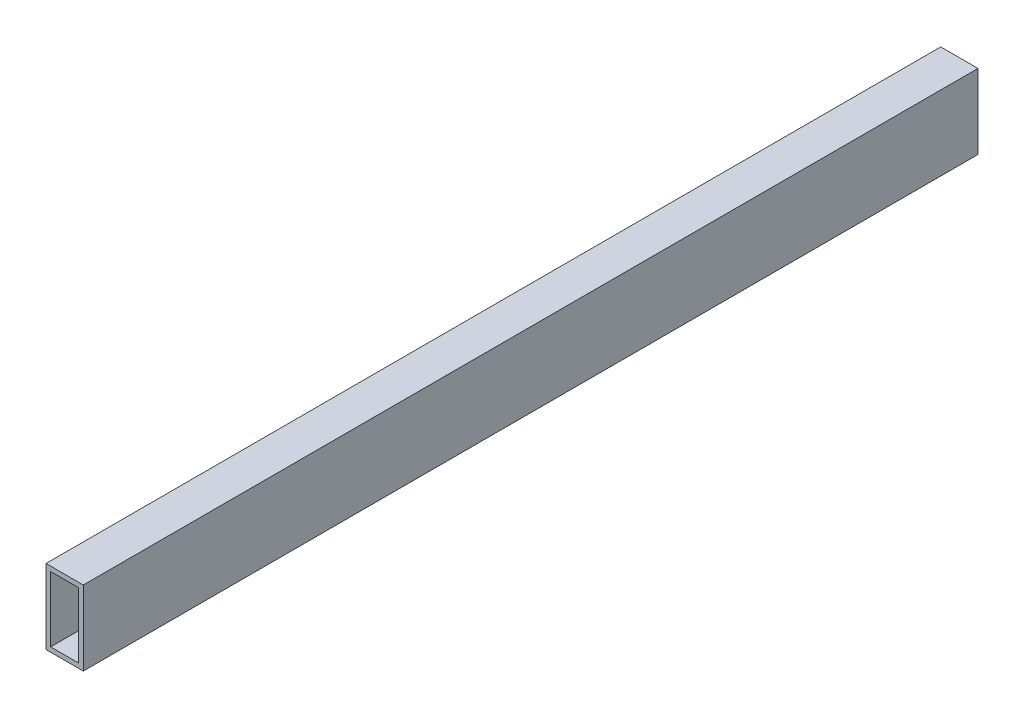
ISO-10303-21;
HEADER;
FILE_DESCRIPTION(('STEP AP214'),'2;1');
FILE_NAME('part.step','',(''),(''),'','','');
FILE_SCHEMA(('AUTOMOTIVE_DESIGN { 1 0 10303 214 1 1 1 1 }'));
ENDSEC;
DATA;
#1=APPLICATION_CONTEXT('core data for automotive mechanical design processes');
#2=APPLICATION_PROTOCOL_DEFINITION('international standard','automotive_design',2000,#1);
#3=PRODUCT_CONTEXT('',#1,'mechanical');
#4=PRODUCT('Part','Part','',(#3));
#5=PRODUCT_RELATED_PRODUCT_CATEGORY('part','',(#4));
#6=PRODUCT_DEFINITION_FORMATION('','',#4);
#7=PRODUCT_DEFINITION_CONTEXT('part definition',#1,'design');
#8=PRODUCT_DEFINITION('design','',#6,#7);
#9=PRODUCT_DEFINITION_SHAPE('','',#8);
#10=(LENGTH_UNIT() NAMED_UNIT(*) SI_UNIT(.MILLI.,.METRE.));
#11=(NAMED_UNIT(*) PLANE_ANGLE_UNIT() SI_UNIT($,.RADIAN.));
#12=(NAMED_UNIT(*) SI_UNIT($,.STERADIAN.) SOLID_ANGLE_UNIT());
#13=UNCERTAINTY_MEASURE_WITH_UNIT(LENGTH_MEASURE(1.E-05),#10,'distance_accuracy_value','');
#14=(GEOMETRIC_REPRESENTATION_CONTEXT(3) GLOBAL_UNCERTAINTY_ASSIGNED_CONTEXT((#13)) GLOBAL_UNIT_ASSIGNED_CONTEXT((#10,
#11,#12)) REPRESENTATION_CONTEXT('',''));
#15=CARTESIAN_POINT('',(0.,0.,0.));
#16=DIRECTION('',(0.,0.,1.));
#17=DIRECTION('',(1.,0.,0.));
#18=AXIS2_PLACEMENT_3D('',#15,#16,#17);
#19=CARTESIAN_POINT('',(0.,0.,609.6));
#20=DIRECTION('',(0.,0.,-1.));
#21=DIRECTION('',(-1.,0.,0.));
#22=AXIS2_PLACEMENT_3D('',#19,#20,#21);
#23=PLANE('',#22);
#24=DIRECTION('',(0.,-1.,0.));
#25=VECTOR('',#24,1.);
#26=CARTESIAN_POINT('',(0.,0.,609.6));
#27=LINE('',#26,#25);
#28=CARTESIAN_POINT('',(0.,50.8,609.6));
#29=VERTEX_POINT('',#28);
#30=CARTESIAN_POINT('',(0.,0.,609.6));
#31=VERTEX_POINT('',#30);
#32=EDGE_CURVE('E159',#29,#31,#27,.T.);
#33=ORIENTED_EDGE('',*,*,#32,.T.);
#34=DIRECTION('',(1.,0.,0.));
#35=VECTOR('',#34,1.);
#36=CARTESIAN_POINT('',(0.,0.,609.6));
#37=LINE('',#36,#35);
#38=CARTESIAN_POINT('',(25.4,0.,609.6));
#39=VERTEX_POINT('',#38);
#40=EDGE_CURVE('E163',#31,#39,#37,.T.);
#41=ORIENTED_EDGE('',*,*,#40,.T.);
#42=DIRECTION('',(0.,1.,0.));
#43=VECTOR('',#42,1.);
#44=CARTESIAN_POINT('',(25.4,0.,609.6));
#45=LINE('',#44,#43);
#46=CARTESIAN_POINT('',(25.4,50.8,609.6));
#47=VERTEX_POINT('',#46);
#48=EDGE_CURVE('E167',#39,#47,#45,.T.);
#49=ORIENTED_EDGE('',*,*,#48,.T.);
#50=DIRECTION('',(-1.,0.,0.));
#51=VECTOR('',#50,1.);
#52=CARTESIAN_POINT('',(0.,50.8,609.6));
#53=LINE('',#52,#51);
#54=EDGE_CURVE('E170',#47,#29,#53,.T.);
#55=ORIENTED_EDGE('',*,*,#54,.T.);
#56=EDGE_LOOP('',(#33,#41,#49,#55));
#57=FACE_BOUND('',#56,.T.);
#58=DIRECTION('',(0.,-1.,0.));
#59=VECTOR('',#58,1.);
#60=CARTESIAN_POINT('',(3.175,3.175,609.6));
#61=LINE('',#60,#59);
#62=CARTESIAN_POINT('',(3.175,47.625,609.6));
#63=VERTEX_POINT('',#62);
#64=CARTESIAN_POINT('',(3.175,3.175,609.6));
#65=VERTEX_POINT('',#64);
#66=EDGE_CURVE('E111',#63,#65,#61,.T.);
#67=ORIENTED_EDGE('',*,*,#66,.F.);
#68=DIRECTION('',(-1.,0.,0.));
#69=VECTOR('',#68,1.);
#70=CARTESIAN_POINT('',(3.175,47.625,609.6));
#71=LINE('',#70,#69);
#72=CARTESIAN_POINT('',(22.225,47.625,609.6));
#73=VERTEX_POINT('',#72);
#74=EDGE_CURVE('E137',#73,#63,#71,.T.);
#75=ORIENTED_EDGE('',*,*,#74,.F.);
#76=DIRECTION('',(0.,1.,0.));
#77=VECTOR('',#76,1.);
#78=CARTESIAN_POINT('',(22.225,3.175,609.6));
#79=LINE('',#78,#77);
#80=CARTESIAN_POINT('',(22.225,3.175,609.6));
#81=VERTEX_POINT('',#80);
#82=EDGE_CURVE('E133',#81,#73,#79,.T.);
#83=ORIENTED_EDGE('',*,*,#82,.F.);
#84=DIRECTION('',(1.,0.,0.));
#85=VECTOR('',#84,1.);
#86=CARTESIAN_POINT('',(3.175,3.175,609.6));
#87=LINE('',#86,#85);
#88=EDGE_CURVE('E120',#65,#81,#87,.T.);
#89=ORIENTED_EDGE('',*,*,#88,.F.);
#90=EDGE_LOOP('',(#67,#75,#83,#89));
#91=FACE_BOUND('',#90,.T.);
#92=ADVANCED_FACE('F45',(#57,#91),#23,.F.);
#93=CARTESIAN_POINT('',(0.,0.,0.));
#94=DIRECTION('',(0.,0.,-1.));
#95=DIRECTION('',(-1.,0.,0.));
#96=AXIS2_PLACEMENT_3D('',#93,#94,#95);
#97=PLANE('',#96);
#98=DIRECTION('',(0.,-1.,0.));
#99=VECTOR('',#98,1.);
#100=CARTESIAN_POINT('',(0.,0.,0.));
#101=LINE('',#100,#99);
#102=CARTESIAN_POINT('',(0.,50.8,0.));
#103=VERTEX_POINT('',#102);
#104=CARTESIAN_POINT('',(0.,0.,0.));
#105=VERTEX_POINT('',#104);
#106=EDGE_CURVE('E129',#103,#105,#101,.T.);
#107=ORIENTED_EDGE('',*,*,#106,.F.);
#108=DIRECTION('',(-1.,0.,0.));
#109=VECTOR('',#108,1.);
#110=CARTESIAN_POINT('',(0.,50.8,0.));
#111=LINE('',#110,#109);
#112=CARTESIAN_POINT('',(25.4,50.8,0.));
#113=VERTEX_POINT('',#112);
#114=EDGE_CURVE('E164',#113,#103,#111,.T.);
#115=ORIENTED_EDGE('',*,*,#114,.F.);
#116=DIRECTION('',(0.,1.,0.));
#117=VECTOR('',#116,1.);
#118=CARTESIAN_POINT('',(25.4,0.,0.));
#119=LINE('',#118,#117);
#120=CARTESIAN_POINT('',(25.4,0.,0.));
#121=VERTEX_POINT('',#120);
#122=EDGE_CURVE('E180',#121,#113,#119,.T.);
#123=ORIENTED_EDGE('',*,*,#122,.F.);
#124=DIRECTION('',(1.,0.,0.));
#125=VECTOR('',#124,1.);
#126=CARTESIAN_POINT('',(0.,0.,0.));
#127=LINE('',#126,#125);
#128=EDGE_CURVE('E177',#105,#121,#127,.T.);
#129=ORIENTED_EDGE('',*,*,#128,.F.);
#130=EDGE_LOOP('',(#107,#115,#123,#129));
#131=FACE_BOUND('',#130,.T.);
#132=DIRECTION('',(-1.,0.,0.));
#133=VECTOR('',#132,1.);
#134=CARTESIAN_POINT('',(3.175,47.625,0.));
#135=LINE('',#134,#133);
#136=CARTESIAN_POINT('',(22.225,47.625,0.));
#137=VERTEX_POINT('',#136);
#138=CARTESIAN_POINT('',(3.175,47.625,0.));
#139=VERTEX_POINT('',#138);
#140=EDGE_CURVE('E121',#137,#139,#135,.T.);
#141=ORIENTED_EDGE('',*,*,#140,.T.);
#142=DIRECTION('',(0.,-1.,0.));
#143=VECTOR('',#142,1.);
#144=CARTESIAN_POINT('',(3.175,3.175,0.));
#145=LINE('',#144,#143);
#146=CARTESIAN_POINT('',(3.175,3.175,0.));
#147=VERTEX_POINT('',#146);
#148=EDGE_CURVE('E69',#139,#147,#145,.T.);
#149=ORIENTED_EDGE('',*,*,#148,.T.);
#150=DIRECTION('',(1.,0.,0.));
#151=VECTOR('',#150,1.);
#152=CARTESIAN_POINT('',(3.175,3.175,0.));
#153=LINE('',#152,#151);
#154=CARTESIAN_POINT('',(22.225,3.175,0.));
#155=VERTEX_POINT('',#154);
#156=EDGE_CURVE('E127',#147,#155,#153,.T.);
#157=ORIENTED_EDGE('',*,*,#156,.T.);
#158=DIRECTION('',(0.,1.,0.));
#159=VECTOR('',#158,1.);
#160=CARTESIAN_POINT('',(22.225,3.175,0.));
#161=LINE('',#160,#159);
#162=EDGE_CURVE('E146',#155,#137,#161,.T.);
#163=ORIENTED_EDGE('',*,*,#162,.T.);
#164=EDGE_LOOP('',(#141,#149,#157,#163));
#165=FACE_BOUND('',#164,.T.);
#166=ADVANCED_FACE('F203',(#131,#165),#97,.T.);
#167=CARTESIAN_POINT('',(0.,0.,609.6));
#168=DIRECTION('',(1.,0.,0.));
#169=DIRECTION('',(0.,0.,-1.));
#170=AXIS2_PLACEMENT_3D('',#167,#168,#169);
#171=PLANE('',#170);
#172=ORIENTED_EDGE('',*,*,#106,.T.);
#173=DIRECTION('',(0.,0.,-1.));
#174=VECTOR('',#173,1.);
#175=CARTESIAN_POINT('',(0.,0.,609.6));
#176=LINE('',#175,#174);
#177=EDGE_CURVE('E11',#31,#105,#176,.T.);
#178=ORIENTED_EDGE('',*,*,#177,.F.);
#179=ORIENTED_EDGE('',*,*,#32,.F.);
#180=DIRECTION('',(0.,0.,-1.));
#181=VECTOR('',#180,1.);
#182=CARTESIAN_POINT('',(0.,50.8,609.6));
#183=LINE('',#182,#181);
#184=EDGE_CURVE('E173',#29,#103,#183,.T.);
#185=ORIENTED_EDGE('',*,*,#184,.T.);
#186=EDGE_LOOP('',(#172,#178,#179,#185));
#187=FACE_BOUND('',#186,.T.);
#188=ADVANCED_FACE('F47',(#187),#171,.F.);
#189=CARTESIAN_POINT('',(0.,0.,609.6));
#190=DIRECTION('',(0.,1.,0.));
#191=DIRECTION('',(0.,0.,1.));
#192=AXIS2_PLACEMENT_3D('',#189,#190,#191);
#193=PLANE('',#192);
#194=ORIENTED_EDGE('',*,*,#128,.T.);
#195=DIRECTION('',(0.,0.,-1.));
#196=VECTOR('',#195,1.);
#197=CARTESIAN_POINT('',(25.4,0.,609.6));
#198=LINE('',#197,#196);
#199=EDGE_CURVE('E54',#39,#121,#198,.T.);
#200=ORIENTED_EDGE('',*,*,#199,.F.);
#201=ORIENTED_EDGE('',*,*,#40,.F.);
#202=ORIENTED_EDGE('',*,*,#177,.T.);
#203=EDGE_LOOP('',(#194,#200,#201,#202));
#204=FACE_BOUND('',#203,.T.);
#205=ADVANCED_FACE('F213',(#204),#193,.F.);
#206=CARTESIAN_POINT('',(25.4,0.,609.6));
#207=DIRECTION('',(-1.,0.,0.));
#208=DIRECTION('',(0.,0.,1.));
#209=AXIS2_PLACEMENT_3D('',#206,#207,#208);
#210=PLANE('',#209);
#211=ORIENTED_EDGE('',*,*,#122,.T.);
#212=DIRECTION('',(0.,0.,-1.));
#213=VECTOR('',#212,1.);
#214=CARTESIAN_POINT('',(25.4,50.8,609.6));
#215=LINE('',#214,#213);
#216=EDGE_CURVE('E188',#47,#113,#215,.T.);
#217=ORIENTED_EDGE('',*,*,#216,.F.);
#218=ORIENTED_EDGE('',*,*,#48,.F.);
#219=ORIENTED_EDGE('',*,*,#199,.T.);
#220=EDGE_LOOP('',(#211,#217,#218,#219));
#221=FACE_BOUND('',#220,.T.);
#222=ADVANCED_FACE('F197',(#221),#210,.F.);
#223=CARTESIAN_POINT('',(0.,50.8,609.6));
#224=DIRECTION('',(0.,-1.,0.));
#225=DIRECTION('',(0.,0.,-1.));
#226=AXIS2_PLACEMENT_3D('',#223,#224,#225);
#227=PLANE('',#226);
#228=ORIENTED_EDGE('',*,*,#114,.T.);
#229=ORIENTED_EDGE('',*,*,#184,.F.);
#230=ORIENTED_EDGE('',*,*,#54,.F.);
#231=ORIENTED_EDGE('',*,*,#216,.T.);
#232=EDGE_LOOP('',(#228,#229,#230,#231));
#233=FACE_BOUND('',#232,.T.);
#234=ADVANCED_FACE('F207',(#233),#227,.F.);
#235=CARTESIAN_POINT('',(3.175,3.175,609.6));
#236=DIRECTION('',(1.,0.,0.));
#237=DIRECTION('',(0.,0.,-1.));
#238=AXIS2_PLACEMENT_3D('',#235,#236,#237);
#239=PLANE('',#238);
#240=ORIENTED_EDGE('',*,*,#148,.F.);
#241=DIRECTION('',(0.,0.,-1.));
#242=VECTOR('',#241,1.);
#243=CARTESIAN_POINT('',(3.175,47.625,609.6));
#244=LINE('',#243,#242);
#245=EDGE_CURVE('E115',#63,#139,#244,.T.);
#246=ORIENTED_EDGE('',*,*,#245,.F.);
#247=ORIENTED_EDGE('',*,*,#66,.T.);
#248=DIRECTION('',(0.,0.,-1.));
#249=VECTOR('',#248,1.);
#250=CARTESIAN_POINT('',(3.175,3.175,609.6));
#251=LINE('',#250,#249);
#252=EDGE_CURVE('E114',#65,#147,#251,.T.);
#253=ORIENTED_EDGE('',*,*,#252,.T.);
#254=EDGE_LOOP('',(#240,#246,#247,#253));
#255=FACE_BOUND('',#254,.T.);
#256=ADVANCED_FACE('F113',(#255),#239,.T.);
#257=CARTESIAN_POINT('',(3.175,3.175,609.6));
#258=DIRECTION('',(0.,1.,0.));
#259=DIRECTION('',(0.,0.,1.));
#260=AXIS2_PLACEMENT_3D('',#257,#258,#259);
#261=PLANE('',#260);
#262=ORIENTED_EDGE('',*,*,#156,.F.);
#263=ORIENTED_EDGE('',*,*,#252,.F.);
#264=ORIENTED_EDGE('',*,*,#88,.T.);
#265=DIRECTION('',(0.,0.,-1.));
#266=VECTOR('',#265,1.);
#267=CARTESIAN_POINT('',(22.225,3.175,609.6));
#268=LINE('',#267,#266);
#269=EDGE_CURVE('E130',#81,#155,#268,.T.);
#270=ORIENTED_EDGE('',*,*,#269,.T.);
#271=EDGE_LOOP('',(#262,#263,#264,#270));
#272=FACE_BOUND('',#271,.T.);
#273=ADVANCED_FACE('F124',(#272),#261,.T.);
#274=CARTESIAN_POINT('',(22.225,3.175,609.6));
#275=DIRECTION('',(-1.,0.,0.));
#276=DIRECTION('',(0.,0.,1.));
#277=AXIS2_PLACEMENT_3D('',#274,#275,#276);
#278=PLANE('',#277);
#279=ORIENTED_EDGE('',*,*,#162,.F.);
#280=ORIENTED_EDGE('',*,*,#269,.F.);
#281=ORIENTED_EDGE('',*,*,#82,.T.);
#282=DIRECTION('',(0.,0.,-1.));
#283=VECTOR('',#282,1.);
#284=CARTESIAN_POINT('',(22.225,47.625,609.6));
#285=LINE('',#284,#283);
#286=EDGE_CURVE('E61',#73,#137,#285,.T.);
#287=ORIENTED_EDGE('',*,*,#286,.T.);
#288=EDGE_LOOP('',(#279,#280,#281,#287));
#289=FACE_BOUND('',#288,.T.);
#290=ADVANCED_FACE('F236',(#289),#278,.T.);
#291=CARTESIAN_POINT('',(3.175,47.625,609.6));
#292=DIRECTION('',(0.,-1.,0.));
#293=DIRECTION('',(0.,0.,-1.));
#294=AXIS2_PLACEMENT_3D('',#291,#292,#293);
#295=PLANE('',#294);
#296=ORIENTED_EDGE('',*,*,#140,.F.);
#297=ORIENTED_EDGE('',*,*,#286,.F.);
#298=ORIENTED_EDGE('',*,*,#74,.T.);
#299=ORIENTED_EDGE('',*,*,#245,.T.);
#300=EDGE_LOOP('',(#296,#297,#298,#299));
#301=FACE_BOUND('',#300,.T.);
#302=ADVANCED_FACE('F240',(#301),#295,.T.);
#303=CLOSED_SHELL('',(#92,#166,#188,#205,#222,#234,#256,#273,#290,#302));
#304=MANIFOLD_SOLID_BREP('B2',#303);
#305=ADVANCED_BREP_SHAPE_REPRESENTATION('',(#18,#304),#14);
#306=SHAPE_DEFINITION_REPRESENTATION(#9,#305);
ENDSEC;
END-ISO-10303-21;
